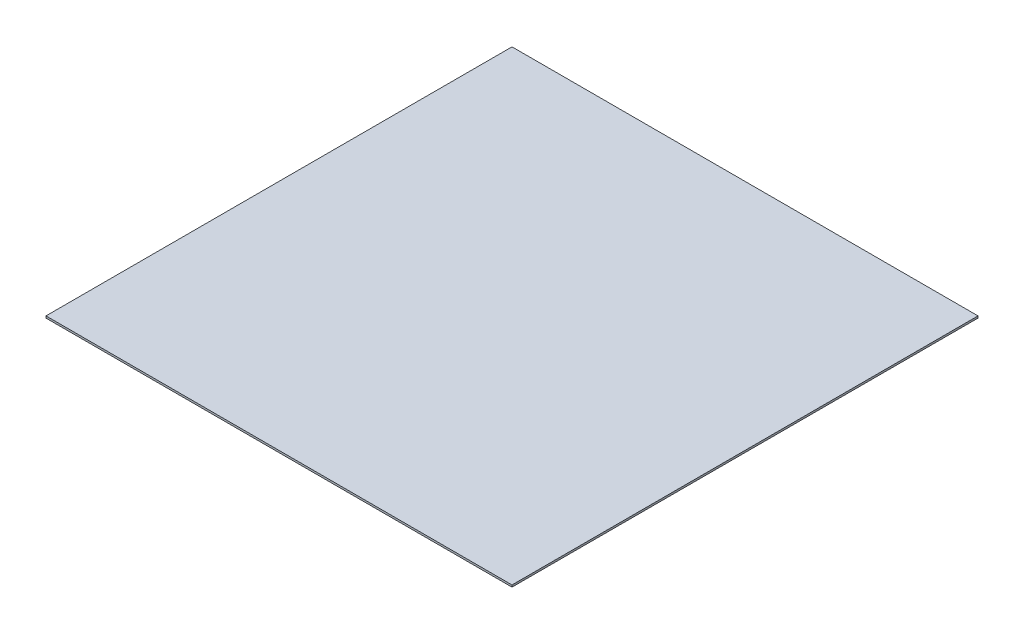
ISO-10303-21;
HEADER;
FILE_DESCRIPTION(('STEP AP214'),'2;1');
FILE_NAME('part.step','',(''),(''),'','','');
FILE_SCHEMA(('AUTOMOTIVE_DESIGN { 1 0 10303 214 1 1 1 1 }'));
ENDSEC;
DATA;
#1=APPLICATION_CONTEXT('core data for automotive mechanical design processes');
#2=APPLICATION_PROTOCOL_DEFINITION('international standard','automotive_design',2000,#1);
#3=PRODUCT_CONTEXT('',#1,'mechanical');
#4=PRODUCT('Part','Part','',(#3));
#5=PRODUCT_RELATED_PRODUCT_CATEGORY('part','',(#4));
#6=PRODUCT_DEFINITION_FORMATION('','',#4);
#7=PRODUCT_DEFINITION_CONTEXT('part definition',#1,'design');
#8=PRODUCT_DEFINITION('design','',#6,#7);
#9=PRODUCT_DEFINITION_SHAPE('','',#8);
#10=(LENGTH_UNIT() NAMED_UNIT(*) SI_UNIT(.MILLI.,.METRE.));
#11=(NAMED_UNIT(*) PLANE_ANGLE_UNIT() SI_UNIT($,.RADIAN.));
#12=(NAMED_UNIT(*) SI_UNIT($,.STERADIAN.) SOLID_ANGLE_UNIT());
#13=UNCERTAINTY_MEASURE_WITH_UNIT(LENGTH_MEASURE(1.E-05),#10,'distance_accuracy_value','');
#14=(GEOMETRIC_REPRESENTATION_CONTEXT(3) GLOBAL_UNCERTAINTY_ASSIGNED_CONTEXT((#13)) GLOBAL_UNIT_ASSIGNED_CONTEXT((#10,
#11,#12)) REPRESENTATION_CONTEXT('',''));
#15=CARTESIAN_POINT('',(0.,0.,0.));
#16=DIRECTION('',(0.,0.,1.));
#17=DIRECTION('',(1.,0.,0.));
#18=AXIS2_PLACEMENT_3D('',#15,#16,#17);
#19=CARTESIAN_POINT('',(1524.,12.7,-1524.));
#20=DIRECTION('',(-1.,0.,0.));
#21=DIRECTION('',(0.,0.,1.));
#22=AXIS2_PLACEMENT_3D('',#19,#20,#21);
#23=PLANE('',#22);
#24=DIRECTION('',(0.,0.,-1.));
#25=VECTOR('',#24,1.);
#26=CARTESIAN_POINT('',(1524.,0.,-1524.));
#27=LINE('',#26,#25);
#28=CARTESIAN_POINT('',(1524.,0.,1524.));
#29=VERTEX_POINT('',#28);
#30=CARTESIAN_POINT('',(1524.,0.,-1524.));
#31=VERTEX_POINT('',#30);
#32=EDGE_CURVE('E96',#29,#31,#27,.T.);
#33=ORIENTED_EDGE('',*,*,#32,.T.);
#34=DIRECTION('',(0.,-1.,0.));
#35=VECTOR('',#34,1.);
#36=CARTESIAN_POINT('',(1524.,12.7,-1524.));
#37=LINE('',#36,#35);
#38=CARTESIAN_POINT('',(1524.,12.7,-1524.));
#39=VERTEX_POINT('',#38);
#40=EDGE_CURVE('E11',#39,#31,#37,.T.);
#41=ORIENTED_EDGE('',*,*,#40,.F.);
#42=DIRECTION('',(0.,0.,-1.));
#43=VECTOR('',#42,1.);
#44=CARTESIAN_POINT('',(1524.,12.7,-1524.));
#45=LINE('',#44,#43);
#46=CARTESIAN_POINT('',(1524.,12.7,1524.));
#47=VERTEX_POINT('',#46);
#48=EDGE_CURVE('E84',#47,#39,#45,.T.);
#49=ORIENTED_EDGE('',*,*,#48,.F.);
#50=DIRECTION('',(0.,-1.,0.));
#51=VECTOR('',#50,1.);
#52=CARTESIAN_POINT('',(1524.,12.7,1524.));
#53=LINE('',#52,#51);
#54=EDGE_CURVE('E92',#47,#29,#53,.T.);
#55=ORIENTED_EDGE('',*,*,#54,.T.);
#56=EDGE_LOOP('',(#33,#41,#49,#55));
#57=FACE_BOUND('',#56,.T.);
#58=ADVANCED_FACE('F33',(#57),#23,.F.);
#59=CARTESIAN_POINT('',(-1524.,12.7,-1524.));
#60=DIRECTION('',(0.,0.,1.));
#61=DIRECTION('',(1.,0.,0.));
#62=AXIS2_PLACEMENT_3D('',#59,#60,#61);
#63=PLANE('',#62);
#64=DIRECTION('',(-1.,0.,0.));
#65=VECTOR('',#64,1.);
#66=CARTESIAN_POINT('',(-1524.,0.,-1524.));
#67=LINE('',#66,#65);
#68=CARTESIAN_POINT('',(-1524.,0.,-1524.));
#69=VERTEX_POINT('',#68);
#70=EDGE_CURVE('E88',#31,#69,#67,.T.);
#71=ORIENTED_EDGE('',*,*,#70,.T.);
#72=DIRECTION('',(0.,-1.,0.));
#73=VECTOR('',#72,1.);
#74=CARTESIAN_POINT('',(-1524.,12.7,-1524.));
#75=LINE('',#74,#73);
#76=CARTESIAN_POINT('',(-1524.,12.7,-1524.));
#77=VERTEX_POINT('',#76);
#78=EDGE_CURVE('E41',#77,#69,#75,.T.);
#79=ORIENTED_EDGE('',*,*,#78,.F.);
#80=DIRECTION('',(-1.,0.,0.));
#81=VECTOR('',#80,1.);
#82=CARTESIAN_POINT('',(-1524.,12.7,-1524.));
#83=LINE('',#82,#81);
#84=EDGE_CURVE('E79',#39,#77,#83,.T.);
#85=ORIENTED_EDGE('',*,*,#84,.F.);
#86=ORIENTED_EDGE('',*,*,#40,.T.);
#87=EDGE_LOOP('',(#71,#79,#85,#86));
#88=FACE_BOUND('',#87,.T.);
#89=ADVANCED_FACE('F87',(#88),#63,.F.);
#90=CARTESIAN_POINT('',(-1524.,12.7,-1524.));
#91=DIRECTION('',(1.,0.,0.));
#92=DIRECTION('',(0.,0.,-1.));
#93=AXIS2_PLACEMENT_3D('',#90,#91,#92);
#94=PLANE('',#93);
#95=DIRECTION('',(0.,0.,1.));
#96=VECTOR('',#95,1.);
#97=CARTESIAN_POINT('',(-1524.,0.,-1524.));
#98=LINE('',#97,#96);
#99=CARTESIAN_POINT('',(-1524.,0.,1524.));
#100=VERTEX_POINT('',#99);
#101=EDGE_CURVE('E66',#69,#100,#98,.T.);
#102=ORIENTED_EDGE('',*,*,#101,.T.);
#103=DIRECTION('',(0.,-1.,0.));
#104=VECTOR('',#103,1.);
#105=CARTESIAN_POINT('',(-1524.,12.7,1524.));
#106=LINE('',#105,#104);
#107=CARTESIAN_POINT('',(-1524.,12.7,1524.));
#108=VERTEX_POINT('',#107);
#109=EDGE_CURVE('E89',#108,#100,#106,.T.);
#110=ORIENTED_EDGE('',*,*,#109,.F.);
#111=DIRECTION('',(0.,0.,1.));
#112=VECTOR('',#111,1.);
#113=CARTESIAN_POINT('',(-1524.,12.7,-1524.));
#114=LINE('',#113,#112);
#115=EDGE_CURVE('E82',#77,#108,#114,.T.);
#116=ORIENTED_EDGE('',*,*,#115,.F.);
#117=ORIENTED_EDGE('',*,*,#78,.T.);
#118=EDGE_LOOP('',(#102,#110,#116,#117));
#119=FACE_BOUND('',#118,.T.);
#120=ADVANCED_FACE('F90',(#119),#94,.F.);
#121=CARTESIAN_POINT('',(-1524.,12.7,1524.));
#122=DIRECTION('',(0.,0.,-1.));
#123=DIRECTION('',(-1.,0.,0.));
#124=AXIS2_PLACEMENT_3D('',#121,#122,#123);
#125=PLANE('',#124);
#126=DIRECTION('',(1.,0.,0.));
#127=VECTOR('',#126,1.);
#128=CARTESIAN_POINT('',(-1524.,0.,1524.));
#129=LINE('',#128,#127);
#130=EDGE_CURVE('E72',#100,#29,#129,.T.);
#131=ORIENTED_EDGE('',*,*,#130,.T.);
#132=ORIENTED_EDGE('',*,*,#54,.F.);
#133=DIRECTION('',(1.,0.,0.));
#134=VECTOR('',#133,1.);
#135=CARTESIAN_POINT('',(-1524.,12.7,1524.));
#136=LINE('',#135,#134);
#137=EDGE_CURVE('E49',#108,#47,#136,.T.);
#138=ORIENTED_EDGE('',*,*,#137,.F.);
#139=ORIENTED_EDGE('',*,*,#109,.T.);
#140=EDGE_LOOP('',(#131,#132,#138,#139));
#141=FACE_BOUND('',#140,.T.);
#142=ADVANCED_FACE('F103',(#141),#125,.F.);
#143=CARTESIAN_POINT('',(0.,12.7,0.));
#144=DIRECTION('',(0.,1.,0.));
#145=DIRECTION('',(0.,0.,1.));
#146=AXIS2_PLACEMENT_3D('',#143,#144,#145);
#147=PLANE('',#146);
#148=ORIENTED_EDGE('',*,*,#48,.T.);
#149=ORIENTED_EDGE('',*,*,#84,.T.);
#150=ORIENTED_EDGE('',*,*,#115,.T.);
#151=ORIENTED_EDGE('',*,*,#137,.T.);
#152=EDGE_LOOP('',(#148,#149,#150,#151));
#153=FACE_BOUND('',#152,.T.);
#154=ADVANCED_FACE('F80',(#153),#147,.T.);
#155=CARTESIAN_POINT('',(0.,0.,0.));
#156=DIRECTION('',(0.,1.,0.));
#157=DIRECTION('',(0.,0.,1.));
#158=AXIS2_PLACEMENT_3D('',#155,#156,#157);
#159=PLANE('',#158);
#160=ORIENTED_EDGE('',*,*,#32,.F.);
#161=ORIENTED_EDGE('',*,*,#130,.F.);
#162=ORIENTED_EDGE('',*,*,#101,.F.);
#163=ORIENTED_EDGE('',*,*,#70,.F.);
#164=EDGE_LOOP('',(#160,#161,#162,#163));
#165=FACE_BOUND('',#164,.T.);
#166=ADVANCED_FACE('F106',(#165),#159,.F.);
#167=CLOSED_SHELL('',(#58,#89,#120,#142,#154,#166));
#168=MANIFOLD_SOLID_BREP('B2',#167);
#169=ADVANCED_BREP_SHAPE_REPRESENTATION('',(#18,#168),#14);
#170=SHAPE_DEFINITION_REPRESENTATION(#9,#169);
ENDSEC;
END-ISO-10303-21;
